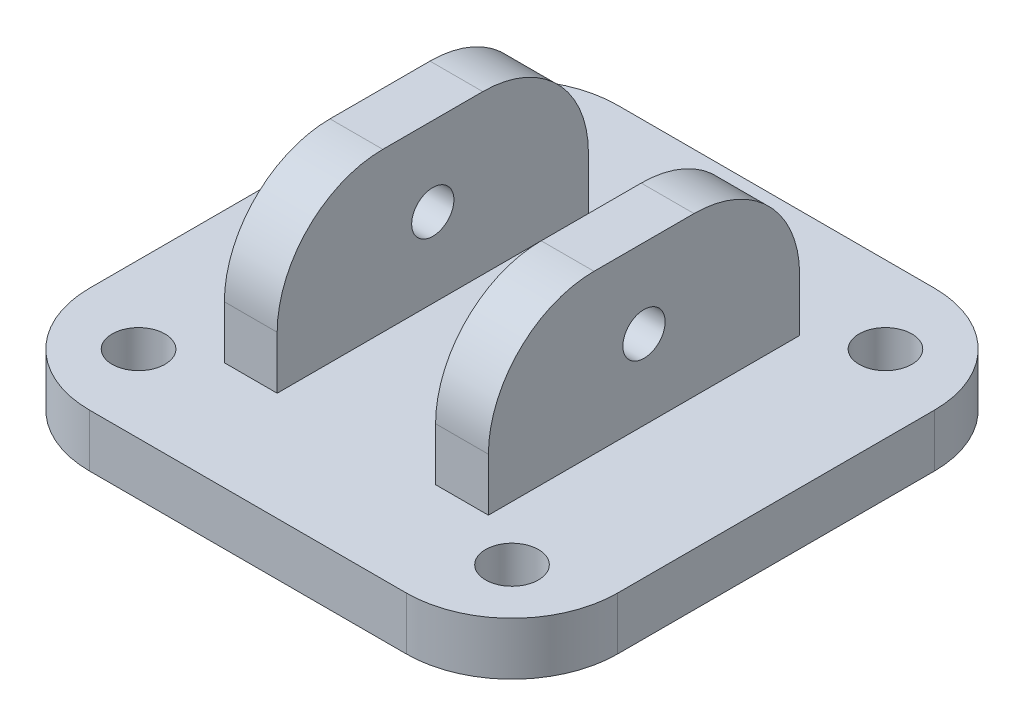
ISO-10303-21;
HEADER;
FILE_DESCRIPTION(('STEP AP214'),'2;1');
FILE_NAME('part.step','',(''),(''),'','','');
FILE_SCHEMA(('AUTOMOTIVE_DESIGN { 1 0 10303 214 1 1 1 1 }'));
ENDSEC;
DATA;
#1=APPLICATION_CONTEXT('core data for automotive mechanical design processes');
#2=APPLICATION_PROTOCOL_DEFINITION('international standard','automotive_design',2000,#1);
#3=PRODUCT_CONTEXT('',#1,'mechanical');
#4=PRODUCT('Part','Part','',(#3));
#5=PRODUCT_RELATED_PRODUCT_CATEGORY('part','',(#4));
#6=PRODUCT_DEFINITION_FORMATION('','',#4);
#7=PRODUCT_DEFINITION_CONTEXT('part definition',#1,'design');
#8=PRODUCT_DEFINITION('design','',#6,#7);
#9=PRODUCT_DEFINITION_SHAPE('','',#8);
#10=(LENGTH_UNIT() NAMED_UNIT(*) SI_UNIT(.MILLI.,.METRE.));
#11=(NAMED_UNIT(*) PLANE_ANGLE_UNIT() SI_UNIT($,.RADIAN.));
#12=(NAMED_UNIT(*) SI_UNIT($,.STERADIAN.) SOLID_ANGLE_UNIT());
#13=UNCERTAINTY_MEASURE_WITH_UNIT(LENGTH_MEASURE(1.E-05),#10,'distance_accuracy_value','');
#14=(GEOMETRIC_REPRESENTATION_CONTEXT(3) GLOBAL_UNCERTAINTY_ASSIGNED_CONTEXT((#13)) GLOBAL_UNIT_ASSIGNED_CONTEXT((#10,
#11,#12)) REPRESENTATION_CONTEXT('',''));
#15=CARTESIAN_POINT('',(0.,0.,0.));
#16=DIRECTION('',(0.,0.,1.));
#17=DIRECTION('',(1.,0.,0.));
#18=AXIS2_PLACEMENT_3D('',#15,#16,#17);
#19=CARTESIAN_POINT('',(0.,5.,0.));
#20=DIRECTION('',(0.,-1.,0.));
#21=DIRECTION('',(0.,0.,-1.));
#22=AXIS2_PLACEMENT_3D('',#19,#20,#21);
#23=PLANE('',#22);
#24=DIRECTION('',(1.,0.,0.));
#25=VECTOR('',#24,1.);
#26=CARTESIAN_POINT('',(0.,5.,14.7343285632564));
#27=LINE('',#26,#25);
#28=CARTESIAN_POINT('',(7.5,5.,14.7343285632564));
#29=VERTEX_POINT('',#28);
#30=CARTESIAN_POINT('',(12.5,5.,14.7343285632564));
#31=VERTEX_POINT('',#30);
#32=EDGE_CURVE('E183',#29,#31,#27,.T.);
#33=ORIENTED_EDGE('',*,*,#32,.F.);
#34=DIRECTION('',(0.,0.,-1.));
#35=VECTOR('',#34,1.);
#36=CARTESIAN_POINT('',(7.5,5.,0.));
#37=LINE('',#36,#35);
#38=CARTESIAN_POINT('',(7.5,5.,-14.7343285632564));
#39=VERTEX_POINT('',#38);
#40=EDGE_CURVE('E193',#29,#39,#37,.T.);
#41=ORIENTED_EDGE('',*,*,#40,.T.);
#42=DIRECTION('',(1.,0.,0.));
#43=VECTOR('',#42,1.);
#44=CARTESIAN_POINT('',(0.,5.,-14.7343285632564));
#45=LINE('',#44,#43);
#46=CARTESIAN_POINT('',(12.5,5.,-14.7343285632564));
#47=VERTEX_POINT('',#46);
#48=EDGE_CURVE('E207',#39,#47,#45,.T.);
#49=ORIENTED_EDGE('',*,*,#48,.T.);
#50=DIRECTION('',(0.,0.,-1.));
#51=VECTOR('',#50,1.);
#52=CARTESIAN_POINT('',(12.5,5.,0.));
#53=LINE('',#52,#51);
#54=EDGE_CURVE('E205',#31,#47,#53,.T.);
#55=ORIENTED_EDGE('',*,*,#54,.F.);
#56=EDGE_LOOP('',(#33,#41,#49,#55));
#57=FACE_BOUND('',#56,.T.);
#58=CARTESIAN_POINT('',(-17.68,5.,17.68));
#59=DIRECTION('',(0.,1.,0.));
#60=DIRECTION('',(0.,0.,-1.));
#61=AXIS2_PLACEMENT_3D('',#58,#59,#60);
#62=CIRCLE('',#61,2.50000000000001);
#63=CARTESIAN_POINT('',(-17.68,5.,15.18));
#64=VERTEX_POINT('',#63);
#65=EDGE_CURVE('E244',#64,#64,#62,.T.);
#66=ORIENTED_EDGE('',*,*,#65,.F.);
#67=EDGE_LOOP('',(#66));
#68=FACE_BOUND('',#67,.T.);
#69=CARTESIAN_POINT('',(17.68,5.,17.68));
#70=DIRECTION('',(0.,1.,0.));
#71=DIRECTION('',(0.,0.,-1.));
#72=AXIS2_PLACEMENT_3D('',#69,#70,#71);
#73=CIRCLE('',#72,2.5);
#74=CARTESIAN_POINT('',(17.68,5.,15.18));
#75=VERTEX_POINT('',#74);
#76=EDGE_CURVE('E250',#75,#75,#73,.T.);
#77=ORIENTED_EDGE('',*,*,#76,.F.);
#78=EDGE_LOOP('',(#77));
#79=FACE_BOUND('',#78,.T.);
#80=CARTESIAN_POINT('',(17.68,5.,-17.68));
#81=DIRECTION('',(0.,1.,0.));
#82=DIRECTION('',(0.,0.,1.));
#83=AXIS2_PLACEMENT_3D('',#80,#81,#82);
#84=CIRCLE('',#83,2.5);
#85=CARTESIAN_POINT('',(17.68,5.,-15.18));
#86=VERTEX_POINT('',#85);
#87=EDGE_CURVE('E256',#86,#86,#84,.T.);
#88=ORIENTED_EDGE('',*,*,#87,.F.);
#89=EDGE_LOOP('',(#88));
#90=FACE_BOUND('',#89,.T.);
#91=CARTESIAN_POINT('',(-17.68,5.,-17.68));
#92=DIRECTION('',(0.,1.,0.));
#93=DIRECTION('',(0.,0.,1.));
#94=AXIS2_PLACEMENT_3D('',#91,#92,#93);
#95=CIRCLE('',#94,2.5);
#96=CARTESIAN_POINT('',(-17.68,5.,-15.18));
#97=VERTEX_POINT('',#96);
#98=EDGE_CURVE('E262',#97,#97,#95,.T.);
#99=ORIENTED_EDGE('',*,*,#98,.F.);
#100=EDGE_LOOP('',(#99));
#101=FACE_BOUND('',#100,.T.);
#102=DIRECTION('',(-1.,0.,0.));
#103=VECTOR('',#102,1.);
#104=CARTESIAN_POINT('',(-25.,5.,-25.));
#105=LINE('',#104,#103);
#106=CARTESIAN_POINT('',(15.,5.,-25.));
#107=VERTEX_POINT('',#106);
#108=CARTESIAN_POINT('',(-15.,5.,-25.));
#109=VERTEX_POINT('',#108);
#110=EDGE_CURVE('E271',#107,#109,#105,.T.);
#111=ORIENTED_EDGE('',*,*,#110,.T.);
#112=CARTESIAN_POINT('',(-15.,5.,-15.));
#113=DIRECTION('',(0.,-1.,0.));
#114=DIRECTION('',(0.,0.,-1.));
#115=AXIS2_PLACEMENT_3D('',#112,#113,#114);
#116=CIRCLE('',#115,10.);
#117=CARTESIAN_POINT('',(-25.,5.,-15.));
#118=VERTEX_POINT('',#117);
#119=EDGE_CURVE('E346',#109,#118,#116,.F.);
#120=ORIENTED_EDGE('',*,*,#119,.T.);
#121=DIRECTION('',(0.,0.,1.));
#122=VECTOR('',#121,1.);
#123=CARTESIAN_POINT('',(-25.,5.,25.));
#124=LINE('',#123,#122);
#125=CARTESIAN_POINT('',(-25.,5.,15.));
#126=VERTEX_POINT('',#125);
#127=EDGE_CURVE('E275',#118,#126,#124,.T.);
#128=ORIENTED_EDGE('',*,*,#127,.T.);
#129=CARTESIAN_POINT('',(-15.,5.,15.));
#130=DIRECTION('',(0.,-1.,0.));
#131=DIRECTION('',(0.,0.,-1.));
#132=AXIS2_PLACEMENT_3D('',#129,#130,#131);
#133=CIRCLE('',#132,10.);
#134=CARTESIAN_POINT('',(-15.,5.,25.));
#135=VERTEX_POINT('',#134);
#136=EDGE_CURVE('E61',#126,#135,#133,.F.);
#137=ORIENTED_EDGE('',*,*,#136,.T.);
#138=DIRECTION('',(1.,0.,0.));
#139=VECTOR('',#138,1.);
#140=CARTESIAN_POINT('',(-25.,5.,25.));
#141=LINE('',#140,#139);
#142=CARTESIAN_POINT('',(15.,5.,25.));
#143=VERTEX_POINT('',#142);
#144=EDGE_CURVE('E277',#135,#143,#141,.T.);
#145=ORIENTED_EDGE('',*,*,#144,.T.);
#146=CARTESIAN_POINT('',(15.,5.,15.));
#147=DIRECTION('',(0.,-1.,0.));
#148=DIRECTION('',(0.,0.,-1.));
#149=AXIS2_PLACEMENT_3D('',#146,#147,#148);
#150=CIRCLE('',#149,10.);
#151=CARTESIAN_POINT('',(25.,5.,15.));
#152=VERTEX_POINT('',#151);
#153=EDGE_CURVE('E342',#143,#152,#150,.F.);
#154=ORIENTED_EDGE('',*,*,#153,.T.);
#155=DIRECTION('',(0.,0.,-1.));
#156=VECTOR('',#155,1.);
#157=CARTESIAN_POINT('',(25.,5.,25.));
#158=LINE('',#157,#156);
#159=CARTESIAN_POINT('',(25.,5.,-15.));
#160=VERTEX_POINT('',#159);
#161=EDGE_CURVE('E268',#152,#160,#158,.T.);
#162=ORIENTED_EDGE('',*,*,#161,.T.);
#163=CARTESIAN_POINT('',(15.,5.,-15.));
#164=DIRECTION('',(0.,-1.,0.));
#165=DIRECTION('',(0.,0.,-1.));
#166=AXIS2_PLACEMENT_3D('',#163,#164,#165);
#167=CIRCLE('',#166,10.);
#168=EDGE_CURVE('E344',#160,#107,#167,.F.);
#169=ORIENTED_EDGE('',*,*,#168,.T.);
#170=EDGE_LOOP('',(#111,#120,#128,#137,#145,#154,#162,#169));
#171=FACE_BOUND('',#170,.T.);
#172=DIRECTION('',(1.,0.,0.));
#173=VECTOR('',#172,1.);
#174=CARTESIAN_POINT('',(0.,5.,14.7343285632564));
#175=LINE('',#174,#173);
#176=CARTESIAN_POINT('',(-12.5,5.,14.7343285632564));
#177=VERTEX_POINT('',#176);
#178=CARTESIAN_POINT('',(-7.5,5.,14.7343285632564));
#179=VERTEX_POINT('',#178);
#180=EDGE_CURVE('E189',#177,#179,#175,.T.);
#181=ORIENTED_EDGE('',*,*,#180,.F.);
#182=DIRECTION('',(0.,0.,-1.));
#183=VECTOR('',#182,1.);
#184=CARTESIAN_POINT('',(-12.5,5.,0.));
#185=LINE('',#184,#183);
#186=CARTESIAN_POINT('',(-12.5,5.,-14.7343285632564));
#187=VERTEX_POINT('',#186);
#188=EDGE_CURVE('E222',#177,#187,#185,.T.);
#189=ORIENTED_EDGE('',*,*,#188,.T.);
#190=DIRECTION('',(1.,0.,0.));
#191=VECTOR('',#190,1.);
#192=CARTESIAN_POINT('',(0.,5.,-14.7343285632564));
#193=LINE('',#192,#191);
#194=CARTESIAN_POINT('',(-7.5,5.,-14.7343285632564));
#195=VERTEX_POINT('',#194);
#196=EDGE_CURVE('E231',#187,#195,#193,.T.);
#197=ORIENTED_EDGE('',*,*,#196,.T.);
#198=DIRECTION('',(0.,0.,-1.));
#199=VECTOR('',#198,1.);
#200=CARTESIAN_POINT('',(-7.5,5.,0.));
#201=LINE('',#200,#199);
#202=EDGE_CURVE('E228',#179,#195,#201,.T.);
#203=ORIENTED_EDGE('',*,*,#202,.F.);
#204=EDGE_LOOP('',(#181,#189,#197,#203));
#205=FACE_BOUND('',#204,.T.);
#206=ADVANCED_FACE('F41',(#57,#68,#79,#90,#101,#171,#205),#23,.F.);
#207=CARTESIAN_POINT('',(0.,0.,0.));
#208=DIRECTION('',(0.,-1.,0.));
#209=DIRECTION('',(0.,0.,-1.));
#210=AXIS2_PLACEMENT_3D('',#207,#208,#209);
#211=PLANE('',#210);
#212=CARTESIAN_POINT('',(17.68,0.,17.68));
#213=DIRECTION('',(0.,1.,0.));
#214=DIRECTION('',(0.,0.,-1.));
#215=AXIS2_PLACEMENT_3D('',#212,#213,#214);
#216=CIRCLE('',#215,2.5);
#217=CARTESIAN_POINT('',(17.68,0.,15.18));
#218=VERTEX_POINT('',#217);
#219=EDGE_CURVE('E247',#218,#218,#216,.T.);
#220=ORIENTED_EDGE('',*,*,#219,.T.);
#221=EDGE_LOOP('',(#220));
#222=FACE_BOUND('',#221,.T.);
#223=CARTESIAN_POINT('',(-17.68,0.,-17.68));
#224=DIRECTION('',(0.,1.,0.));
#225=DIRECTION('',(0.,0.,1.));
#226=AXIS2_PLACEMENT_3D('',#223,#224,#225);
#227=CIRCLE('',#226,2.5);
#228=CARTESIAN_POINT('',(-17.68,0.,-15.18));
#229=VERTEX_POINT('',#228);
#230=EDGE_CURVE('E259',#229,#229,#227,.T.);
#231=ORIENTED_EDGE('',*,*,#230,.T.);
#232=EDGE_LOOP('',(#231));
#233=FACE_BOUND('',#232,.T.);
#234=DIRECTION('',(0.,0.,1.));
#235=VECTOR('',#234,1.);
#236=CARTESIAN_POINT('',(-25.,0.,25.));
#237=LINE('',#236,#235);
#238=CARTESIAN_POINT('',(-25.,0.,-15.));
#239=VERTEX_POINT('',#238);
#240=CARTESIAN_POINT('',(-25.,0.,15.));
#241=VERTEX_POINT('',#240);
#242=EDGE_CURVE('E285',#239,#241,#237,.T.);
#243=ORIENTED_EDGE('',*,*,#242,.F.);
#244=CARTESIAN_POINT('',(-15.,0.,-15.));
#245=DIRECTION('',(0.,-1.,0.));
#246=DIRECTION('',(0.,0.,-1.));
#247=AXIS2_PLACEMENT_3D('',#244,#245,#246);
#248=CIRCLE('',#247,10.);
#249=CARTESIAN_POINT('',(-15.,0.,-25.));
#250=VERTEX_POINT('',#249);
#251=EDGE_CURVE('E334',#239,#250,#248,.T.);
#252=ORIENTED_EDGE('',*,*,#251,.T.);
#253=DIRECTION('',(-1.,0.,0.));
#254=VECTOR('',#253,1.);
#255=CARTESIAN_POINT('',(-25.,0.,-25.));
#256=LINE('',#255,#254);
#257=CARTESIAN_POINT('',(15.,0.,-25.));
#258=VERTEX_POINT('',#257);
#259=EDGE_CURVE('E282',#258,#250,#256,.T.);
#260=ORIENTED_EDGE('',*,*,#259,.F.);
#261=CARTESIAN_POINT('',(15.,0.,-15.));
#262=DIRECTION('',(0.,-1.,0.));
#263=DIRECTION('',(0.,0.,-1.));
#264=AXIS2_PLACEMENT_3D('',#261,#262,#263);
#265=CIRCLE('',#264,10.);
#266=CARTESIAN_POINT('',(25.,0.,-15.));
#267=VERTEX_POINT('',#266);
#268=EDGE_CURVE('E332',#258,#267,#265,.T.);
#269=ORIENTED_EDGE('',*,*,#268,.T.);
#270=DIRECTION('',(0.,0.,-1.));
#271=VECTOR('',#270,1.);
#272=CARTESIAN_POINT('',(25.,0.,25.));
#273=LINE('',#272,#271);
#274=CARTESIAN_POINT('',(25.,0.,15.));
#275=VERTEX_POINT('',#274);
#276=EDGE_CURVE('E265',#275,#267,#273,.T.);
#277=ORIENTED_EDGE('',*,*,#276,.F.);
#278=CARTESIAN_POINT('',(15.,0.,15.));
#279=DIRECTION('',(0.,-1.,0.));
#280=DIRECTION('',(0.,0.,-1.));
#281=AXIS2_PLACEMENT_3D('',#278,#279,#280);
#282=CIRCLE('',#281,10.);
#283=CARTESIAN_POINT('',(15.,0.,25.));
#284=VERTEX_POINT('',#283);
#285=EDGE_CURVE('E330',#275,#284,#282,.T.);
#286=ORIENTED_EDGE('',*,*,#285,.T.);
#287=DIRECTION('',(1.,0.,0.));
#288=VECTOR('',#287,1.);
#289=CARTESIAN_POINT('',(-25.,0.,25.));
#290=LINE('',#289,#288);
#291=CARTESIAN_POINT('',(-15.,0.,25.));
#292=VERTEX_POINT('',#291);
#293=EDGE_CURVE('E272',#292,#284,#290,.T.);
#294=ORIENTED_EDGE('',*,*,#293,.F.);
#295=CARTESIAN_POINT('',(-15.,0.,15.));
#296=DIRECTION('',(0.,-1.,0.));
#297=DIRECTION('',(0.,0.,-1.));
#298=AXIS2_PLACEMENT_3D('',#295,#296,#297);
#299=CIRCLE('',#298,10.);
#300=EDGE_CURVE('E328',#292,#241,#299,.T.);
#301=ORIENTED_EDGE('',*,*,#300,.T.);
#302=EDGE_LOOP('',(#243,#252,#260,#269,#277,#286,#294,#301));
#303=FACE_BOUND('',#302,.T.);
#304=CARTESIAN_POINT('',(17.68,0.,-17.68));
#305=DIRECTION('',(0.,1.,0.));
#306=DIRECTION('',(0.,0.,1.));
#307=AXIS2_PLACEMENT_3D('',#304,#305,#306);
#308=CIRCLE('',#307,2.5);
#309=CARTESIAN_POINT('',(17.68,0.,-15.18));
#310=VERTEX_POINT('',#309);
#311=EDGE_CURVE('E253',#310,#310,#308,.T.);
#312=ORIENTED_EDGE('',*,*,#311,.T.);
#313=EDGE_LOOP('',(#312));
#314=FACE_BOUND('',#313,.T.);
#315=CARTESIAN_POINT('',(-17.68,0.,17.68));
#316=DIRECTION('',(0.,1.,0.));
#317=DIRECTION('',(0.,0.,-1.));
#318=AXIS2_PLACEMENT_3D('',#315,#316,#317);
#319=CIRCLE('',#318,2.50000000000001);
#320=CARTESIAN_POINT('',(-17.68,0.,15.18));
#321=VERTEX_POINT('',#320);
#322=EDGE_CURVE('E243',#321,#321,#319,.T.);
#323=ORIENTED_EDGE('',*,*,#322,.T.);
#324=EDGE_LOOP('',(#323));
#325=FACE_BOUND('',#324,.T.);
#326=ADVANCED_FACE('F359',(#222,#233,#303,#314,#325),#211,.T.);
#327=CARTESIAN_POINT('',(25.,5.,25.));
#328=DIRECTION('',(-1.,0.,0.));
#329=DIRECTION('',(0.,0.,1.));
#330=AXIS2_PLACEMENT_3D('',#327,#328,#329);
#331=PLANE('',#330);
#332=ORIENTED_EDGE('',*,*,#276,.T.);
#333=DIRECTION('',(0.,-1.,0.));
#334=VECTOR('',#333,1.);
#335=CARTESIAN_POINT('',(25.,5.,-15.));
#336=LINE('',#335,#334);
#337=EDGE_CURVE('E351',#267,#160,#336,.F.);
#338=ORIENTED_EDGE('',*,*,#337,.T.);
#339=ORIENTED_EDGE('',*,*,#161,.F.);
#340=DIRECTION('',(0.,-1.,0.));
#341=VECTOR('',#340,1.);
#342=CARTESIAN_POINT('',(25.,5.,15.));
#343=LINE('',#342,#341);
#344=EDGE_CURVE('E348',#152,#275,#343,.T.);
#345=ORIENTED_EDGE('',*,*,#344,.T.);
#346=EDGE_LOOP('',(#332,#338,#339,#345));
#347=FACE_BOUND('',#346,.T.);
#348=ADVANCED_FACE('F368',(#347),#331,.F.);
#349=CARTESIAN_POINT('',(-25.,5.,-25.));
#350=DIRECTION('',(0.,0.,1.));
#351=DIRECTION('',(1.,0.,0.));
#352=AXIS2_PLACEMENT_3D('',#349,#350,#351);
#353=PLANE('',#352);
#354=ORIENTED_EDGE('',*,*,#259,.T.);
#355=DIRECTION('',(0.,-1.,0.));
#356=VECTOR('',#355,1.);
#357=CARTESIAN_POINT('',(-15.,5.,-25.));
#358=LINE('',#357,#356);
#359=EDGE_CURVE('E339',#250,#109,#358,.F.);
#360=ORIENTED_EDGE('',*,*,#359,.T.);
#361=ORIENTED_EDGE('',*,*,#110,.F.);
#362=DIRECTION('',(0.,-1.,0.));
#363=VECTOR('',#362,1.);
#364=CARTESIAN_POINT('',(15.,5.,-25.));
#365=LINE('',#364,#363);
#366=EDGE_CURVE('E336',#107,#258,#365,.T.);
#367=ORIENTED_EDGE('',*,*,#366,.T.);
#368=EDGE_LOOP('',(#354,#360,#361,#367));
#369=FACE_BOUND('',#368,.T.);
#370=ADVANCED_FACE('F378',(#369),#353,.F.);
#371=CARTESIAN_POINT('',(-25.,5.,25.));
#372=DIRECTION('',(1.,0.,0.));
#373=DIRECTION('',(0.,0.,-1.));
#374=AXIS2_PLACEMENT_3D('',#371,#372,#373);
#375=PLANE('',#374);
#376=ORIENTED_EDGE('',*,*,#127,.F.);
#377=DIRECTION('',(0.,-1.,0.));
#378=VECTOR('',#377,1.);
#379=CARTESIAN_POINT('',(-25.,5.,-15.));
#380=LINE('',#379,#378);
#381=EDGE_CURVE('E325',#118,#239,#380,.T.);
#382=ORIENTED_EDGE('',*,*,#381,.T.);
#383=ORIENTED_EDGE('',*,*,#242,.T.);
#384=DIRECTION('',(0.,-1.,0.));
#385=VECTOR('',#384,1.);
#386=CARTESIAN_POINT('',(-25.,5.,15.));
#387=LINE('',#386,#385);
#388=EDGE_CURVE('E323',#241,#126,#387,.F.);
#389=ORIENTED_EDGE('',*,*,#388,.T.);
#390=EDGE_LOOP('',(#376,#382,#383,#389));
#391=FACE_BOUND('',#390,.T.);
#392=ADVANCED_FACE('F386',(#391),#375,.F.);
#393=CARTESIAN_POINT('',(-25.,5.,25.));
#394=DIRECTION('',(0.,0.,-1.));
#395=DIRECTION('',(-1.,0.,0.));
#396=AXIS2_PLACEMENT_3D('',#393,#394,#395);
#397=PLANE('',#396);
#398=ORIENTED_EDGE('',*,*,#293,.T.);
#399=DIRECTION('',(0.,-1.,0.));
#400=VECTOR('',#399,1.);
#401=CARTESIAN_POINT('',(15.,5.,25.));
#402=LINE('',#401,#400);
#403=EDGE_CURVE('E11',#284,#143,#402,.F.);
#404=ORIENTED_EDGE('',*,*,#403,.T.);
#405=ORIENTED_EDGE('',*,*,#144,.F.);
#406=DIRECTION('',(0.,-1.,0.));
#407=VECTOR('',#406,1.);
#408=CARTESIAN_POINT('',(-15.,5.,25.));
#409=LINE('',#408,#407);
#410=EDGE_CURVE('E49',#135,#292,#409,.T.);
#411=ORIENTED_EDGE('',*,*,#410,.T.);
#412=EDGE_LOOP('',(#398,#404,#405,#411));
#413=FACE_BOUND('',#412,.T.);
#414=ADVANCED_FACE('F355',(#413),#397,.F.);
#415=CARTESIAN_POINT('',(-17.68,5.,-17.68));
#416=DIRECTION('',(0.,-1.,0.));
#417=DIRECTION('',(0.,0.,-1.));
#418=AXIS2_PLACEMENT_3D('',#415,#416,#417);
#419=CYLINDRICAL_SURFACE('',#418,2.5);
#420=ORIENTED_EDGE('',*,*,#98,.T.);
#421=EDGE_LOOP('',(#420));
#422=FACE_BOUND('',#421,.T.);
#423=ORIENTED_EDGE('',*,*,#230,.F.);
#424=EDGE_LOOP('',(#423));
#425=FACE_BOUND('',#424,.T.);
#426=ADVANCED_FACE('F400',(#422,#425),#419,.F.);
#427=CARTESIAN_POINT('',(17.68,5.,-17.68));
#428=DIRECTION('',(0.,-1.,0.));
#429=DIRECTION('',(0.,0.,-1.));
#430=AXIS2_PLACEMENT_3D('',#427,#428,#429);
#431=CYLINDRICAL_SURFACE('',#430,2.5);
#432=ORIENTED_EDGE('',*,*,#87,.T.);
#433=EDGE_LOOP('',(#432));
#434=FACE_BOUND('',#433,.T.);
#435=ORIENTED_EDGE('',*,*,#311,.F.);
#436=EDGE_LOOP('',(#435));
#437=FACE_BOUND('',#436,.T.);
#438=ADVANCED_FACE('F598',(#434,#437),#431,.F.);
#439=CARTESIAN_POINT('',(17.68,5.,17.68));
#440=DIRECTION('',(0.,-1.,0.));
#441=DIRECTION('',(0.,0.,-1.));
#442=AXIS2_PLACEMENT_3D('',#439,#440,#441);
#443=CYLINDRICAL_SURFACE('',#442,2.5);
#444=ORIENTED_EDGE('',*,*,#76,.T.);
#445=EDGE_LOOP('',(#444));
#446=FACE_BOUND('',#445,.T.);
#447=ORIENTED_EDGE('',*,*,#219,.F.);
#448=EDGE_LOOP('',(#447));
#449=FACE_BOUND('',#448,.T.);
#450=ADVANCED_FACE('F589',(#446,#449),#443,.F.);
#451=CARTESIAN_POINT('',(-17.68,5.,17.68));
#452=DIRECTION('',(0.,-1.,0.));
#453=DIRECTION('',(0.,0.,-1.));
#454=AXIS2_PLACEMENT_3D('',#451,#452,#453);
#455=CYLINDRICAL_SURFACE('',#454,2.50000000000001);
#456=ORIENTED_EDGE('',*,*,#65,.T.);
#457=EDGE_LOOP('',(#456));
#458=FACE_BOUND('',#457,.T.);
#459=ORIENTED_EDGE('',*,*,#322,.F.);
#460=EDGE_LOOP('',(#459));
#461=FACE_BOUND('',#460,.T.);
#462=ADVANCED_FACE('F576',(#458,#461),#455,.F.);
#463=CARTESIAN_POINT('',(0.,20.,14.7343285632564));
#464=DIRECTION('',(0.,0.,-1.));
#465=DIRECTION('',(-1.,0.,0.));
#466=AXIS2_PLACEMENT_3D('',#463,#464,#465);
#467=PLANE('',#466);
#468=DIRECTION('',(0.,-1.,0.));
#469=VECTOR('',#468,1.);
#470=CARTESIAN_POINT('',(-7.5,20.,14.7343285632564));
#471=LINE('',#470,#469);
#472=CARTESIAN_POINT('',(-7.5,10.,14.7343285632564));
#473=VERTEX_POINT('',#472);
#474=EDGE_CURVE('E241',#473,#179,#471,.T.);
#475=ORIENTED_EDGE('',*,*,#474,.F.);
#476=DIRECTION('',(1.,0.,0.));
#477=VECTOR('',#476,1.);
#478=CARTESIAN_POINT('',(-12.5,10.,14.7343285632564));
#479=LINE('',#478,#477);
#480=CARTESIAN_POINT('',(-12.5,10.,14.7343285632564));
#481=VERTEX_POINT('',#480);
#482=EDGE_CURVE('E314',#473,#481,#479,.F.);
#483=ORIENTED_EDGE('',*,*,#482,.T.);
#484=DIRECTION('',(0.,-1.,0.));
#485=VECTOR('',#484,1.);
#486=CARTESIAN_POINT('',(-12.5,20.,14.7343285632564));
#487=LINE('',#486,#485);
#488=EDGE_CURVE('E225',#481,#177,#487,.T.);
#489=ORIENTED_EDGE('',*,*,#488,.T.);
#490=ORIENTED_EDGE('',*,*,#180,.T.);
#491=EDGE_LOOP('',(#475,#483,#489,#490));
#492=FACE_BOUND('',#491,.T.);
#493=ADVANCED_FACE('F568',(#492),#467,.F.);
#494=CARTESIAN_POINT('',(-7.5,20.,0.));
#495=DIRECTION('',(-1.,0.,0.));
#496=DIRECTION('',(0.,0.,1.));
#497=AXIS2_PLACEMENT_3D('',#494,#495,#496);
#498=PLANE('',#497);
#499=CARTESIAN_POINT('',(-7.5,12.5,0.));
#500=DIRECTION('',(-1.,0.,0.));
#501=DIRECTION('',(0.,0.,1.));
#502=AXIS2_PLACEMENT_3D('',#499,#500,#501);
#503=CIRCLE('',#502,2.);
#504=CARTESIAN_POINT('',(-7.5,12.5,2.));
#505=VERTEX_POINT('',#504);
#506=EDGE_CURVE('E201',#505,#505,#503,.T.);
#507=ORIENTED_EDGE('',*,*,#506,.T.);
#508=EDGE_LOOP('',(#507));
#509=FACE_BOUND('',#508,.T.);
#510=DIRECTION('',(0.,0.,-1.));
#511=VECTOR('',#510,1.);
#512=CARTESIAN_POINT('',(-7.5,20.,0.));
#513=LINE('',#512,#511);
#514=CARTESIAN_POINT('',(-7.5,20.,4.7343285632564));
#515=VERTEX_POINT('',#514);
#516=CARTESIAN_POINT('',(-7.5,20.,-4.73432856325641));
#517=VERTEX_POINT('',#516);
#518=EDGE_CURVE('E218',#515,#517,#513,.T.);
#519=ORIENTED_EDGE('',*,*,#518,.F.);
#520=CARTESIAN_POINT('',(-7.5,10.,4.7343285632564));
#521=DIRECTION('',(-1.,0.,0.));
#522=DIRECTION('',(0.,0.,1.));
#523=AXIS2_PLACEMENT_3D('',#520,#521,#522);
#524=CIRCLE('',#523,10.);
#525=EDGE_CURVE('E312',#515,#473,#524,.F.);
#526=ORIENTED_EDGE('',*,*,#525,.T.);
#527=ORIENTED_EDGE('',*,*,#474,.T.);
#528=ORIENTED_EDGE('',*,*,#202,.T.);
#529=DIRECTION('',(0.,-1.,0.));
#530=VECTOR('',#529,1.);
#531=CARTESIAN_POINT('',(-7.5,20.,-14.7343285632564));
#532=LINE('',#531,#530);
#533=CARTESIAN_POINT('',(-7.5,10.,-14.7343285632564));
#534=VERTEX_POINT('',#533);
#535=EDGE_CURVE('E239',#534,#195,#532,.T.);
#536=ORIENTED_EDGE('',*,*,#535,.F.);
#537=CARTESIAN_POINT('',(-7.5,10.,-4.73432856325641));
#538=DIRECTION('',(-1.,0.,0.));
#539=DIRECTION('',(0.,0.,1.));
#540=AXIS2_PLACEMENT_3D('',#537,#538,#539);
#541=CIRCLE('',#540,10.);
#542=EDGE_CURVE('E310',#534,#517,#541,.F.);
#543=ORIENTED_EDGE('',*,*,#542,.T.);
#544=EDGE_LOOP('',(#519,#526,#527,#528,#536,#543));
#545=FACE_BOUND('',#544,.T.);
#546=ADVANCED_FACE('F559',(#509,#545),#498,.F.);
#547=CARTESIAN_POINT('',(0.,20.,-14.7343285632564));
#548=DIRECTION('',(0.,0.,-1.));
#549=DIRECTION('',(-1.,0.,0.));
#550=AXIS2_PLACEMENT_3D('',#547,#548,#549);
#551=PLANE('',#550);
#552=DIRECTION('',(0.,-1.,0.));
#553=VECTOR('',#552,1.);
#554=CARTESIAN_POINT('',(-12.5,20.,-14.7343285632564));
#555=LINE('',#554,#553);
#556=CARTESIAN_POINT('',(-12.5,10.,-14.7343285632564));
#557=VERTEX_POINT('',#556);
#558=EDGE_CURVE('E237',#557,#187,#555,.T.);
#559=ORIENTED_EDGE('',*,*,#558,.F.);
#560=DIRECTION('',(1.,0.,0.));
#561=VECTOR('',#560,1.);
#562=CARTESIAN_POINT('',(0.,10.,-14.7343285632564));
#563=LINE('',#562,#561);
#564=EDGE_CURVE('E320',#557,#534,#563,.T.);
#565=ORIENTED_EDGE('',*,*,#564,.T.);
#566=ORIENTED_EDGE('',*,*,#535,.T.);
#567=ORIENTED_EDGE('',*,*,#196,.F.);
#568=EDGE_LOOP('',(#559,#565,#566,#567));
#569=FACE_BOUND('',#568,.T.);
#570=ADVANCED_FACE('F550',(#569),#551,.T.);
#571=CARTESIAN_POINT('',(-12.5,20.,0.));
#572=DIRECTION('',(-1.,0.,0.));
#573=DIRECTION('',(0.,0.,1.));
#574=AXIS2_PLACEMENT_3D('',#571,#572,#573);
#575=PLANE('',#574);
#576=CARTESIAN_POINT('',(-12.5,12.5,0.));
#577=DIRECTION('',(-1.,0.,0.));
#578=DIRECTION('',(0.,0.,1.));
#579=AXIS2_PLACEMENT_3D('',#576,#577,#578);
#580=CIRCLE('',#579,2.);
#581=CARTESIAN_POINT('',(-12.5,12.5,2.));
#582=VERTEX_POINT('',#581);
#583=EDGE_CURVE('E701',#582,#582,#580,.T.);
#584=ORIENTED_EDGE('',*,*,#583,.F.);
#585=EDGE_LOOP('',(#584));
#586=FACE_BOUND('',#585,.T.);
#587=ORIENTED_EDGE('',*,*,#488,.F.);
#588=CARTESIAN_POINT('',(-12.5,10.,4.7343285632564));
#589=DIRECTION('',(-1.,0.,0.));
#590=DIRECTION('',(0.,0.,1.));
#591=AXIS2_PLACEMENT_3D('',#588,#589,#590);
#592=CIRCLE('',#591,10.);
#593=CARTESIAN_POINT('',(-12.5,20.,4.7343285632564));
#594=VERTEX_POINT('',#593);
#595=EDGE_CURVE('E318',#481,#594,#592,.T.);
#596=ORIENTED_EDGE('',*,*,#595,.T.);
#597=DIRECTION('',(0.,0.,-1.));
#598=VECTOR('',#597,1.);
#599=CARTESIAN_POINT('',(-12.5,20.,0.));
#600=LINE('',#599,#598);
#601=CARTESIAN_POINT('',(-12.5,20.,-4.73432856325641));
#602=VERTEX_POINT('',#601);
#603=EDGE_CURVE('E221',#594,#602,#600,.T.);
#604=ORIENTED_EDGE('',*,*,#603,.T.);
#605=CARTESIAN_POINT('',(-12.5,10.,-4.73432856325641));
#606=DIRECTION('',(-1.,0.,0.));
#607=DIRECTION('',(0.,0.,1.));
#608=AXIS2_PLACEMENT_3D('',#605,#606,#607);
#609=CIRCLE('',#608,10.);
#610=EDGE_CURVE('E316',#602,#557,#609,.T.);
#611=ORIENTED_EDGE('',*,*,#610,.T.);
#612=ORIENTED_EDGE('',*,*,#558,.T.);
#613=ORIENTED_EDGE('',*,*,#188,.F.);
#614=EDGE_LOOP('',(#587,#596,#604,#611,#612,#613));
#615=FACE_BOUND('',#614,.T.);
#616=ADVANCED_FACE('F541',(#586,#615),#575,.T.);
#617=CARTESIAN_POINT('',(0.,20.,0.));
#618=DIRECTION('',(0.,1.,0.));
#619=DIRECTION('',(0.,0.,1.));
#620=AXIS2_PLACEMENT_3D('',#617,#618,#619);
#621=PLANE('',#620);
#622=ORIENTED_EDGE('',*,*,#603,.F.);
#623=DIRECTION('',(1.,0.,0.));
#624=VECTOR('',#623,1.);
#625=CARTESIAN_POINT('',(-7.5,20.,4.7343285632564));
#626=LINE('',#625,#624);
#627=EDGE_CURVE('E307',#594,#515,#626,.T.);
#628=ORIENTED_EDGE('',*,*,#627,.T.);
#629=ORIENTED_EDGE('',*,*,#518,.T.);
#630=DIRECTION('',(1.,0.,0.));
#631=VECTOR('',#630,1.);
#632=CARTESIAN_POINT('',(0.,20.,-4.73432856325641));
#633=LINE('',#632,#631);
#634=EDGE_CURVE('E305',#517,#602,#633,.F.);
#635=ORIENTED_EDGE('',*,*,#634,.T.);
#636=EDGE_LOOP('',(#622,#628,#629,#635));
#637=FACE_BOUND('',#636,.T.);
#638=ADVANCED_FACE('F532',(#637),#621,.T.);
#639=CARTESIAN_POINT('',(7.5,20.,0.));
#640=DIRECTION('',(-1.,0.,0.));
#641=DIRECTION('',(0.,0.,1.));
#642=AXIS2_PLACEMENT_3D('',#639,#640,#641);
#643=PLANE('',#642);
#644=CARTESIAN_POINT('',(7.5,12.5,0.));
#645=DIRECTION('',(-1.,0.,0.));
#646=DIRECTION('',(0.,0.,1.));
#647=AXIS2_PLACEMENT_3D('',#644,#645,#646);
#648=CIRCLE('',#647,2.);
#649=CARTESIAN_POINT('',(7.5,12.5,2.));
#650=VERTEX_POINT('',#649);
#651=EDGE_CURVE('E704',#650,#650,#648,.T.);
#652=ORIENTED_EDGE('',*,*,#651,.F.);
#653=EDGE_LOOP('',(#652));
#654=FACE_BOUND('',#653,.T.);
#655=DIRECTION('',(0.,0.,-1.));
#656=VECTOR('',#655,1.);
#657=CARTESIAN_POINT('',(7.5,20.,0.));
#658=LINE('',#657,#656);
#659=CARTESIAN_POINT('',(7.5,20.,4.7343285632564));
#660=VERTEX_POINT('',#659);
#661=CARTESIAN_POINT('',(7.5,20.,-4.73432856325641));
#662=VERTEX_POINT('',#661);
#663=EDGE_CURVE('E212',#660,#662,#658,.T.);
#664=ORIENTED_EDGE('',*,*,#663,.T.);
#665=CARTESIAN_POINT('',(7.5,10.,-4.73432856325641));
#666=DIRECTION('',(-1.,0.,0.));
#667=DIRECTION('',(0.,0.,1.));
#668=AXIS2_PLACEMENT_3D('',#665,#666,#667);
#669=CIRCLE('',#668,10.);
#670=CARTESIAN_POINT('',(7.5,10.,-14.7343285632564));
#671=VERTEX_POINT('',#670);
#672=EDGE_CURVE('E302',#662,#671,#669,.T.);
#673=ORIENTED_EDGE('',*,*,#672,.T.);
#674=DIRECTION('',(0.,-1.,0.));
#675=VECTOR('',#674,1.);
#676=CARTESIAN_POINT('',(7.5,20.,-14.7343285632564));
#677=LINE('',#676,#675);
#678=EDGE_CURVE('E197',#671,#39,#677,.T.);
#679=ORIENTED_EDGE('',*,*,#678,.T.);
#680=ORIENTED_EDGE('',*,*,#40,.F.);
#681=DIRECTION('',(0.,-1.,0.));
#682=VECTOR('',#681,1.);
#683=CARTESIAN_POINT('',(7.5,20.,14.7343285632564));
#684=LINE('',#683,#682);
#685=CARTESIAN_POINT('',(7.5,10.,14.7343285632564));
#686=VERTEX_POINT('',#685);
#687=EDGE_CURVE('E178',#686,#29,#684,.T.);
#688=ORIENTED_EDGE('',*,*,#687,.F.);
#689=CARTESIAN_POINT('',(7.5,10.,4.7343285632564));
#690=DIRECTION('',(-1.,0.,0.));
#691=DIRECTION('',(0.,0.,1.));
#692=AXIS2_PLACEMENT_3D('',#689,#690,#691);
#693=CIRCLE('',#692,10.);
#694=EDGE_CURVE('E300',#686,#660,#693,.T.);
#695=ORIENTED_EDGE('',*,*,#694,.T.);
#696=EDGE_LOOP('',(#664,#673,#679,#680,#688,#695));
#697=FACE_BOUND('',#696,.T.);
#698=ADVANCED_FACE('F195',(#654,#697),#643,.T.);
#699=CARTESIAN_POINT('',(0.,20.,14.7343285632564));
#700=DIRECTION('',(0.,0.,-1.));
#701=DIRECTION('',(-1.,0.,0.));
#702=AXIS2_PLACEMENT_3D('',#699,#700,#701);
#703=PLANE('',#702);
#704=DIRECTION('',(0.,-1.,0.));
#705=VECTOR('',#704,1.);
#706=CARTESIAN_POINT('',(12.5,20.,14.7343285632564));
#707=LINE('',#706,#705);
#708=CARTESIAN_POINT('',(12.5,10.,14.7343285632564));
#709=VERTEX_POINT('',#708);
#710=EDGE_CURVE('E190',#709,#31,#707,.T.);
#711=ORIENTED_EDGE('',*,*,#710,.F.);
#712=DIRECTION('',(1.,0.,0.));
#713=VECTOR('',#712,1.);
#714=CARTESIAN_POINT('',(7.5,10.,14.7343285632564));
#715=LINE('',#714,#713);
#716=EDGE_CURVE('E186',#709,#686,#715,.F.);
#717=ORIENTED_EDGE('',*,*,#716,.T.);
#718=ORIENTED_EDGE('',*,*,#687,.T.);
#719=ORIENTED_EDGE('',*,*,#32,.T.);
#720=EDGE_LOOP('',(#711,#717,#718,#719));
#721=FACE_BOUND('',#720,.T.);
#722=ADVANCED_FACE('F181',(#721),#703,.F.);
#723=CARTESIAN_POINT('',(12.5,20.,0.));
#724=DIRECTION('',(-1.,0.,0.));
#725=DIRECTION('',(0.,0.,1.));
#726=AXIS2_PLACEMENT_3D('',#723,#724,#725);
#727=PLANE('',#726);
#728=CARTESIAN_POINT('',(12.5,12.5,0.));
#729=DIRECTION('',(1.,0.,0.));
#730=DIRECTION('',(0.,0.,-1.));
#731=AXIS2_PLACEMENT_3D('',#728,#729,#730);
#732=CIRCLE('',#731,2.);
#733=CARTESIAN_POINT('',(12.5,12.5,-2.));
#734=VERTEX_POINT('',#733);
#735=EDGE_CURVE('E719',#734,#734,#732,.T.);
#736=ORIENTED_EDGE('',*,*,#735,.F.);
#737=EDGE_LOOP('',(#736));
#738=FACE_BOUND('',#737,.T.);
#739=DIRECTION('',(0.,-1.,0.));
#740=VECTOR('',#739,1.);
#741=CARTESIAN_POINT('',(12.5,20.,-14.7343285632564));
#742=LINE('',#741,#740);
#743=CARTESIAN_POINT('',(12.5,10.,-14.7343285632564));
#744=VERTEX_POINT('',#743);
#745=EDGE_CURVE('E214',#744,#47,#742,.T.);
#746=ORIENTED_EDGE('',*,*,#745,.F.);
#747=CARTESIAN_POINT('',(12.5,10.,-4.73432856325641));
#748=DIRECTION('',(-1.,0.,0.));
#749=DIRECTION('',(0.,0.,1.));
#750=AXIS2_PLACEMENT_3D('',#747,#748,#749);
#751=CIRCLE('',#750,10.);
#752=CARTESIAN_POINT('',(12.5,20.,-4.73432856325641));
#753=VERTEX_POINT('',#752);
#754=EDGE_CURVE('E293',#744,#753,#751,.F.);
#755=ORIENTED_EDGE('',*,*,#754,.T.);
#756=DIRECTION('',(0.,0.,-1.));
#757=VECTOR('',#756,1.);
#758=CARTESIAN_POINT('',(12.5,20.,0.));
#759=LINE('',#758,#757);
#760=CARTESIAN_POINT('',(12.5,20.,4.7343285632564));
#761=VERTEX_POINT('',#760);
#762=EDGE_CURVE('E215',#761,#753,#759,.T.);
#763=ORIENTED_EDGE('',*,*,#762,.F.);
#764=CARTESIAN_POINT('',(12.5,10.,4.7343285632564));
#765=DIRECTION('',(-1.,0.,0.));
#766=DIRECTION('',(0.,0.,1.));
#767=AXIS2_PLACEMENT_3D('',#764,#765,#766);
#768=CIRCLE('',#767,10.);
#769=EDGE_CURVE('E291',#761,#709,#768,.F.);
#770=ORIENTED_EDGE('',*,*,#769,.T.);
#771=ORIENTED_EDGE('',*,*,#710,.T.);
#772=ORIENTED_EDGE('',*,*,#54,.T.);
#773=EDGE_LOOP('',(#746,#755,#763,#770,#771,#772));
#774=FACE_BOUND('',#773,.T.);
#775=ADVANCED_FACE('F508',(#738,#774),#727,.F.);
#776=CARTESIAN_POINT('',(0.,20.,-14.7343285632564));
#777=DIRECTION('',(0.,0.,-1.));
#778=DIRECTION('',(-1.,0.,0.));
#779=AXIS2_PLACEMENT_3D('',#776,#777,#778);
#780=PLANE('',#779);
#781=ORIENTED_EDGE('',*,*,#678,.F.);
#782=DIRECTION('',(1.,0.,0.));
#783=VECTOR('',#782,1.);
#784=CARTESIAN_POINT('',(0.,10.,-14.7343285632564));
#785=LINE('',#784,#783);
#786=EDGE_CURVE('E279',#671,#744,#785,.T.);
#787=ORIENTED_EDGE('',*,*,#786,.T.);
#788=ORIENTED_EDGE('',*,*,#745,.T.);
#789=ORIENTED_EDGE('',*,*,#48,.F.);
#790=EDGE_LOOP('',(#781,#787,#788,#789));
#791=FACE_BOUND('',#790,.T.);
#792=ADVANCED_FACE('F499',(#791),#780,.T.);
#793=CARTESIAN_POINT('',(0.,20.,0.));
#794=DIRECTION('',(0.,1.,0.));
#795=DIRECTION('',(0.,0.,1.));
#796=AXIS2_PLACEMENT_3D('',#793,#794,#795);
#797=PLANE('',#796);
#798=ORIENTED_EDGE('',*,*,#762,.T.);
#799=DIRECTION('',(1.,0.,0.));
#800=VECTOR('',#799,1.);
#801=CARTESIAN_POINT('',(0.,20.,-4.73432856325641));
#802=LINE('',#801,#800);
#803=EDGE_CURVE('E298',#753,#662,#802,.F.);
#804=ORIENTED_EDGE('',*,*,#803,.T.);
#805=ORIENTED_EDGE('',*,*,#663,.F.);
#806=DIRECTION('',(1.,0.,0.));
#807=VECTOR('',#806,1.);
#808=CARTESIAN_POINT('',(12.5,20.,4.7343285632564));
#809=LINE('',#808,#807);
#810=EDGE_CURVE('E295',#660,#761,#809,.T.);
#811=ORIENTED_EDGE('',*,*,#810,.T.);
#812=EDGE_LOOP('',(#798,#804,#805,#811));
#813=FACE_BOUND('',#812,.T.);
#814=ADVANCED_FACE('F491',(#813),#797,.T.);
#815=CARTESIAN_POINT('',(-25.,12.5,0.));
#816=DIRECTION('',(1.,0.,0.));
#817=DIRECTION('',(0.,0.,-1.));
#818=AXIS2_PLACEMENT_3D('',#815,#816,#817);
#819=CYLINDRICAL_SURFACE('',#818,2.);
#820=ORIENTED_EDGE('',*,*,#651,.T.);
#821=EDGE_LOOP('',(#820));
#822=FACE_BOUND('',#821,.T.);
#823=ORIENTED_EDGE('',*,*,#735,.T.);
#824=EDGE_LOOP('',(#823));
#825=FACE_BOUND('',#824,.T.);
#826=ADVANCED_FACE('F481',(#822,#825),#819,.F.);
#827=ORIENTED_EDGE('',*,*,#583,.T.);
#828=EDGE_LOOP('',(#827));
#829=FACE_BOUND('',#828,.T.);
#830=ORIENTED_EDGE('',*,*,#506,.F.);
#831=EDGE_LOOP('',(#830));
#832=FACE_BOUND('',#831,.T.);
#833=ADVANCED_FACE('F415',(#829,#832),#819,.F.);
#834=CARTESIAN_POINT('',(0.,10.,-4.73432856325641));
#835=DIRECTION('',(1.,0.,0.));
#836=DIRECTION('',(0.,0.,-1.));
#837=AXIS2_PLACEMENT_3D('',#834,#835,#836);
#838=CYLINDRICAL_SURFACE('',#837,10.);
#839=ORIENTED_EDGE('',*,*,#672,.F.);
#840=ORIENTED_EDGE('',*,*,#803,.F.);
#841=ORIENTED_EDGE('',*,*,#754,.F.);
#842=ORIENTED_EDGE('',*,*,#786,.F.);
#843=EDGE_LOOP('',(#839,#840,#841,#842));
#844=FACE_BOUND('',#843,.T.);
#845=ADVANCED_FACE('F411',(#844),#838,.T.);
#846=CARTESIAN_POINT('',(0.,10.,4.7343285632564));
#847=DIRECTION('',(-1.,0.,0.));
#848=DIRECTION('',(0.,0.,1.));
#849=AXIS2_PLACEMENT_3D('',#846,#847,#848);
#850=CYLINDRICAL_SURFACE('',#849,10.);
#851=ORIENTED_EDGE('',*,*,#694,.F.);
#852=ORIENTED_EDGE('',*,*,#716,.F.);
#853=ORIENTED_EDGE('',*,*,#769,.F.);
#854=ORIENTED_EDGE('',*,*,#810,.F.);
#855=EDGE_LOOP('',(#851,#852,#853,#854));
#856=FACE_BOUND('',#855,.T.);
#857=ADVANCED_FACE('F414',(#856),#850,.T.);
#858=CARTESIAN_POINT('',(0.,10.,4.7343285632564));
#859=DIRECTION('',(-1.,0.,0.));
#860=DIRECTION('',(0.,0.,1.));
#861=AXIS2_PLACEMENT_3D('',#858,#859,#860);
#862=CYLINDRICAL_SURFACE('',#861,10.);
#863=ORIENTED_EDGE('',*,*,#595,.F.);
#864=ORIENTED_EDGE('',*,*,#482,.F.);
#865=ORIENTED_EDGE('',*,*,#525,.F.);
#866=ORIENTED_EDGE('',*,*,#627,.F.);
#867=EDGE_LOOP('',(#863,#864,#865,#866));
#868=FACE_BOUND('',#867,.T.);
#869=ADVANCED_FACE('F419',(#868),#862,.T.);
#870=CARTESIAN_POINT('',(0.,10.,-4.73432856325641));
#871=DIRECTION('',(1.,0.,0.));
#872=DIRECTION('',(0.,0.,-1.));
#873=AXIS2_PLACEMENT_3D('',#870,#871,#872);
#874=CYLINDRICAL_SURFACE('',#873,10.);
#875=ORIENTED_EDGE('',*,*,#610,.F.);
#876=ORIENTED_EDGE('',*,*,#634,.F.);
#877=ORIENTED_EDGE('',*,*,#542,.F.);
#878=ORIENTED_EDGE('',*,*,#564,.F.);
#879=EDGE_LOOP('',(#875,#876,#877,#878));
#880=FACE_BOUND('',#879,.T.);
#881=ADVANCED_FACE('F423',(#880),#874,.T.);
#882=CARTESIAN_POINT('',(-15.,5.,-15.));
#883=DIRECTION('',(0.,-1.,0.));
#884=DIRECTION('',(0.,0.,-1.));
#885=AXIS2_PLACEMENT_3D('',#882,#883,#884);
#886=CYLINDRICAL_SURFACE('',#885,10.);
#887=ORIENTED_EDGE('',*,*,#119,.F.);
#888=ORIENTED_EDGE('',*,*,#359,.F.);
#889=ORIENTED_EDGE('',*,*,#251,.F.);
#890=ORIENTED_EDGE('',*,*,#381,.F.);
#891=EDGE_LOOP('',(#887,#888,#889,#890));
#892=FACE_BOUND('',#891,.T.);
#893=ADVANCED_FACE('F383',(#892),#886,.T.);
#894=CARTESIAN_POINT('',(15.,5.,-15.));
#895=DIRECTION('',(0.,-1.,0.));
#896=DIRECTION('',(0.,0.,-1.));
#897=AXIS2_PLACEMENT_3D('',#894,#895,#896);
#898=CYLINDRICAL_SURFACE('',#897,10.);
#899=ORIENTED_EDGE('',*,*,#168,.F.);
#900=ORIENTED_EDGE('',*,*,#337,.F.);
#901=ORIENTED_EDGE('',*,*,#268,.F.);
#902=ORIENTED_EDGE('',*,*,#366,.F.);
#903=EDGE_LOOP('',(#899,#900,#901,#902));
#904=FACE_BOUND('',#903,.T.);
#905=ADVANCED_FACE('F375',(#904),#898,.T.);
#906=CARTESIAN_POINT('',(15.,5.,15.));
#907=DIRECTION('',(0.,-1.,0.));
#908=DIRECTION('',(0.,0.,-1.));
#909=AXIS2_PLACEMENT_3D('',#906,#907,#908);
#910=CYLINDRICAL_SURFACE('',#909,10.);
#911=ORIENTED_EDGE('',*,*,#153,.F.);
#912=ORIENTED_EDGE('',*,*,#403,.F.);
#913=ORIENTED_EDGE('',*,*,#285,.F.);
#914=ORIENTED_EDGE('',*,*,#344,.F.);
#915=EDGE_LOOP('',(#911,#912,#913,#914));
#916=FACE_BOUND('',#915,.T.);
#917=ADVANCED_FACE('F365',(#916),#910,.T.);
#918=CARTESIAN_POINT('',(-15.,5.,15.));
#919=DIRECTION('',(0.,-1.,0.));
#920=DIRECTION('',(0.,0.,-1.));
#921=AXIS2_PLACEMENT_3D('',#918,#919,#920);
#922=CYLINDRICAL_SURFACE('',#921,10.);
#923=ORIENTED_EDGE('',*,*,#136,.F.);
#924=ORIENTED_EDGE('',*,*,#388,.F.);
#925=ORIENTED_EDGE('',*,*,#300,.F.);
#926=ORIENTED_EDGE('',*,*,#410,.F.);
#927=EDGE_LOOP('',(#923,#924,#925,#926));
#928=FACE_BOUND('',#927,.T.);
#929=ADVANCED_FACE('F43',(#928),#922,.T.);
#930=CLOSED_SHELL('',(#206,#326,#348,#370,#392,#414,#426,#438,#450,#462,#493,#546,#570,#616,
#638,#698,#722,#775,#792,#814,#826,#833,#845,#857,#869,#881,#893,#905,#917,#929));
#931=MANIFOLD_SOLID_BREP('B2',#930);
#932=ADVANCED_BREP_SHAPE_REPRESENTATION('',(#18,#931),#14);
#933=SHAPE_DEFINITION_REPRESENTATION(#9,#932);
ENDSEC;
END-ISO-10303-21;
